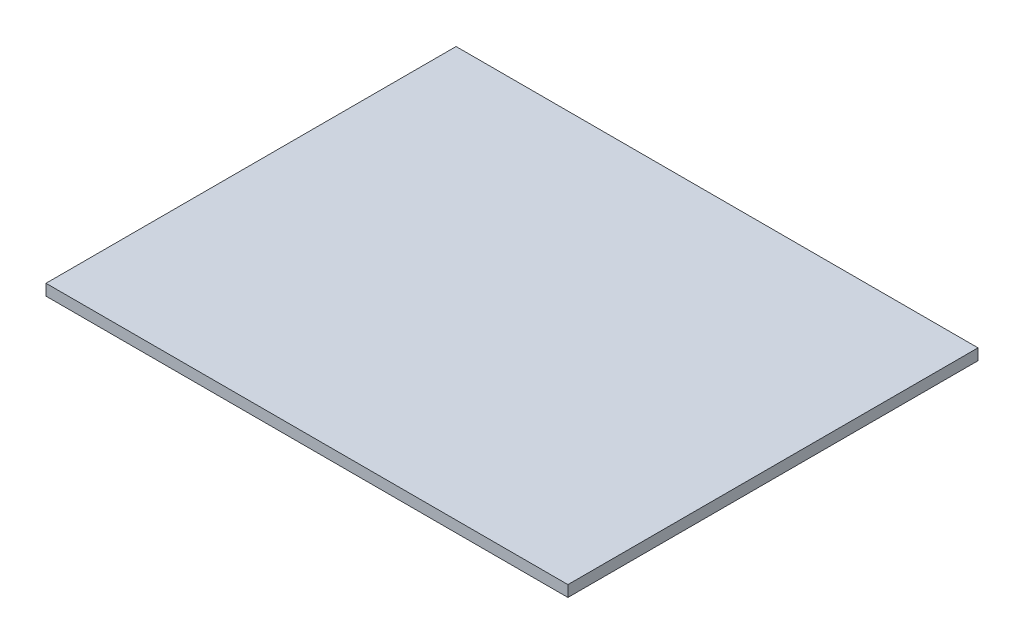
ISO-10303-21;
HEADER;
FILE_DESCRIPTION(('STEP AP214'),'2;1');
FILE_NAME('part.step','',(''),(''),'','','');
FILE_SCHEMA(('AUTOMOTIVE_DESIGN { 1 0 10303 214 1 1 1 1 }'));
ENDSEC;
DATA;
#1=APPLICATION_CONTEXT('core data for automotive mechanical design processes');
#2=APPLICATION_PROTOCOL_DEFINITION('international standard','automotive_design',2000,#1);
#3=PRODUCT_CONTEXT('',#1,'mechanical');
#4=PRODUCT('Part','Part','',(#3));
#5=PRODUCT_RELATED_PRODUCT_CATEGORY('part','',(#4));
#6=PRODUCT_DEFINITION_FORMATION('','',#4);
#7=PRODUCT_DEFINITION_CONTEXT('part definition',#1,'design');
#8=PRODUCT_DEFINITION('design','',#6,#7);
#9=PRODUCT_DEFINITION_SHAPE('','',#8);
#10=(LENGTH_UNIT() NAMED_UNIT(*) SI_UNIT(.MILLI.,.METRE.));
#11=(NAMED_UNIT(*) PLANE_ANGLE_UNIT() SI_UNIT($,.RADIAN.));
#12=(NAMED_UNIT(*) SI_UNIT($,.STERADIAN.) SOLID_ANGLE_UNIT());
#13=UNCERTAINTY_MEASURE_WITH_UNIT(LENGTH_MEASURE(1.E-05),#10,'distance_accuracy_value','');
#14=(GEOMETRIC_REPRESENTATION_CONTEXT(3) GLOBAL_UNCERTAINTY_ASSIGNED_CONTEXT((#13)) GLOBAL_UNIT_ASSIGNED_CONTEXT((#10,
#11,#12)) REPRESENTATION_CONTEXT('',''));
#15=CARTESIAN_POINT('',(0.,0.,0.));
#16=DIRECTION('',(0.,0.,1.));
#17=DIRECTION('',(1.,0.,0.));
#18=AXIS2_PLACEMENT_3D('',#15,#16,#17);
#19=CARTESIAN_POINT('',(-35.,1.5,-27.5));
#20=DIRECTION('',(1.,0.,0.));
#21=DIRECTION('',(0.,0.,-1.));
#22=AXIS2_PLACEMENT_3D('',#19,#20,#21);
#23=PLANE('',#22);
#24=DIRECTION('',(0.,0.,1.));
#25=VECTOR('',#24,1.);
#26=CARTESIAN_POINT('',(-35.,0.,-27.5));
#27=LINE('',#26,#25);
#28=CARTESIAN_POINT('',(-35.,0.,-27.5));
#29=VERTEX_POINT('',#28);
#30=CARTESIAN_POINT('',(-35.,0.,27.5));
#31=VERTEX_POINT('',#30);
#32=EDGE_CURVE('E96',#29,#31,#27,.T.);
#33=ORIENTED_EDGE('',*,*,#32,.T.);
#34=DIRECTION('',(0.,-1.,0.));
#35=VECTOR('',#34,1.);
#36=CARTESIAN_POINT('',(-35.,1.5,27.5));
#37=LINE('',#36,#35);
#38=CARTESIAN_POINT('',(-35.,1.5,27.5));
#39=VERTEX_POINT('',#38);
#40=EDGE_CURVE('E11',#39,#31,#37,.T.);
#41=ORIENTED_EDGE('',*,*,#40,.F.);
#42=DIRECTION('',(0.,0.,1.));
#43=VECTOR('',#42,1.);
#44=CARTESIAN_POINT('',(-35.,1.5,-27.5));
#45=LINE('',#44,#43);
#46=CARTESIAN_POINT('',(-35.,1.5,-27.5));
#47=VERTEX_POINT('',#46);
#48=EDGE_CURVE('E84',#47,#39,#45,.T.);
#49=ORIENTED_EDGE('',*,*,#48,.F.);
#50=DIRECTION('',(0.,-1.,0.));
#51=VECTOR('',#50,1.);
#52=CARTESIAN_POINT('',(-35.,1.5,-27.5));
#53=LINE('',#52,#51);
#54=EDGE_CURVE('E92',#47,#29,#53,.T.);
#55=ORIENTED_EDGE('',*,*,#54,.T.);
#56=EDGE_LOOP('',(#33,#41,#49,#55));
#57=FACE_BOUND('',#56,.T.);
#58=ADVANCED_FACE('F33',(#57),#23,.F.);
#59=CARTESIAN_POINT('',(35.,1.5,27.5));
#60=DIRECTION('',(0.,0.,-1.));
#61=DIRECTION('',(-1.,0.,0.));
#62=AXIS2_PLACEMENT_3D('',#59,#60,#61);
#63=PLANE('',#62);
#64=DIRECTION('',(1.,0.,0.));
#65=VECTOR('',#64,1.);
#66=CARTESIAN_POINT('',(35.,0.,27.5));
#67=LINE('',#66,#65);
#68=CARTESIAN_POINT('',(35.,0.,27.5));
#69=VERTEX_POINT('',#68);
#70=EDGE_CURVE('E88',#31,#69,#67,.T.);
#71=ORIENTED_EDGE('',*,*,#70,.T.);
#72=DIRECTION('',(0.,-1.,0.));
#73=VECTOR('',#72,1.);
#74=CARTESIAN_POINT('',(35.,1.5,27.5));
#75=LINE('',#74,#73);
#76=CARTESIAN_POINT('',(35.,1.5,27.5));
#77=VERTEX_POINT('',#76);
#78=EDGE_CURVE('E41',#77,#69,#75,.T.);
#79=ORIENTED_EDGE('',*,*,#78,.F.);
#80=DIRECTION('',(1.,0.,0.));
#81=VECTOR('',#80,1.);
#82=CARTESIAN_POINT('',(35.,1.5,27.5));
#83=LINE('',#82,#81);
#84=EDGE_CURVE('E79',#39,#77,#83,.T.);
#85=ORIENTED_EDGE('',*,*,#84,.F.);
#86=ORIENTED_EDGE('',*,*,#40,.T.);
#87=EDGE_LOOP('',(#71,#79,#85,#86));
#88=FACE_BOUND('',#87,.T.);
#89=ADVANCED_FACE('F87',(#88),#63,.F.);
#90=CARTESIAN_POINT('',(35.,1.5,-27.5));
#91=DIRECTION('',(-1.,0.,0.));
#92=DIRECTION('',(0.,0.,1.));
#93=AXIS2_PLACEMENT_3D('',#90,#91,#92);
#94=PLANE('',#93);
#95=DIRECTION('',(0.,0.,-1.));
#96=VECTOR('',#95,1.);
#97=CARTESIAN_POINT('',(35.,0.,-27.5));
#98=LINE('',#97,#96);
#99=CARTESIAN_POINT('',(35.,0.,-27.5));
#100=VERTEX_POINT('',#99);
#101=EDGE_CURVE('E66',#69,#100,#98,.T.);
#102=ORIENTED_EDGE('',*,*,#101,.T.);
#103=DIRECTION('',(0.,-1.,0.));
#104=VECTOR('',#103,1.);
#105=CARTESIAN_POINT('',(35.,1.5,-27.5));
#106=LINE('',#105,#104);
#107=CARTESIAN_POINT('',(35.,1.5,-27.5));
#108=VERTEX_POINT('',#107);
#109=EDGE_CURVE('E89',#108,#100,#106,.T.);
#110=ORIENTED_EDGE('',*,*,#109,.F.);
#111=DIRECTION('',(0.,0.,-1.));
#112=VECTOR('',#111,1.);
#113=CARTESIAN_POINT('',(35.,1.5,-27.5));
#114=LINE('',#113,#112);
#115=EDGE_CURVE('E82',#77,#108,#114,.T.);
#116=ORIENTED_EDGE('',*,*,#115,.F.);
#117=ORIENTED_EDGE('',*,*,#78,.T.);
#118=EDGE_LOOP('',(#102,#110,#116,#117));
#119=FACE_BOUND('',#118,.T.);
#120=ADVANCED_FACE('F90',(#119),#94,.F.);
#121=CARTESIAN_POINT('',(35.,1.5,-27.5));
#122=DIRECTION('',(0.,0.,1.));
#123=DIRECTION('',(1.,0.,0.));
#124=AXIS2_PLACEMENT_3D('',#121,#122,#123);
#125=PLANE('',#124);
#126=DIRECTION('',(-1.,0.,0.));
#127=VECTOR('',#126,1.);
#128=CARTESIAN_POINT('',(35.,0.,-27.5));
#129=LINE('',#128,#127);
#130=EDGE_CURVE('E72',#100,#29,#129,.T.);
#131=ORIENTED_EDGE('',*,*,#130,.T.);
#132=ORIENTED_EDGE('',*,*,#54,.F.);
#133=DIRECTION('',(-1.,0.,0.));
#134=VECTOR('',#133,1.);
#135=CARTESIAN_POINT('',(35.,1.5,-27.5));
#136=LINE('',#135,#134);
#137=EDGE_CURVE('E49',#108,#47,#136,.T.);
#138=ORIENTED_EDGE('',*,*,#137,.F.);
#139=ORIENTED_EDGE('',*,*,#109,.T.);
#140=EDGE_LOOP('',(#131,#132,#138,#139));
#141=FACE_BOUND('',#140,.T.);
#142=ADVANCED_FACE('F103',(#141),#125,.F.);
#143=CARTESIAN_POINT('',(0.,1.5,0.));
#144=DIRECTION('',(0.,-1.,0.));
#145=DIRECTION('',(0.,0.,-1.));
#146=AXIS2_PLACEMENT_3D('',#143,#144,#145);
#147=PLANE('',#146);
#148=ORIENTED_EDGE('',*,*,#48,.T.);
#149=ORIENTED_EDGE('',*,*,#84,.T.);
#150=ORIENTED_EDGE('',*,*,#115,.T.);
#151=ORIENTED_EDGE('',*,*,#137,.T.);
#152=EDGE_LOOP('',(#148,#149,#150,#151));
#153=FACE_BOUND('',#152,.T.);
#154=ADVANCED_FACE('F80',(#153),#147,.F.);
#155=CARTESIAN_POINT('',(0.,0.,0.));
#156=DIRECTION('',(0.,-1.,0.));
#157=DIRECTION('',(0.,0.,-1.));
#158=AXIS2_PLACEMENT_3D('',#155,#156,#157);
#159=PLANE('',#158);
#160=ORIENTED_EDGE('',*,*,#32,.F.);
#161=ORIENTED_EDGE('',*,*,#130,.F.);
#162=ORIENTED_EDGE('',*,*,#101,.F.);
#163=ORIENTED_EDGE('',*,*,#70,.F.);
#164=EDGE_LOOP('',(#160,#161,#162,#163));
#165=FACE_BOUND('',#164,.T.);
#166=ADVANCED_FACE('F106',(#165),#159,.T.);
#167=CLOSED_SHELL('',(#58,#89,#120,#142,#154,#166));
#168=MANIFOLD_SOLID_BREP('B2',#167);
#169=ADVANCED_BREP_SHAPE_REPRESENTATION('',(#18,#168),#14);
#170=SHAPE_DEFINITION_REPRESENTATION(#9,#169);
ENDSEC;
END-ISO-10303-21;
